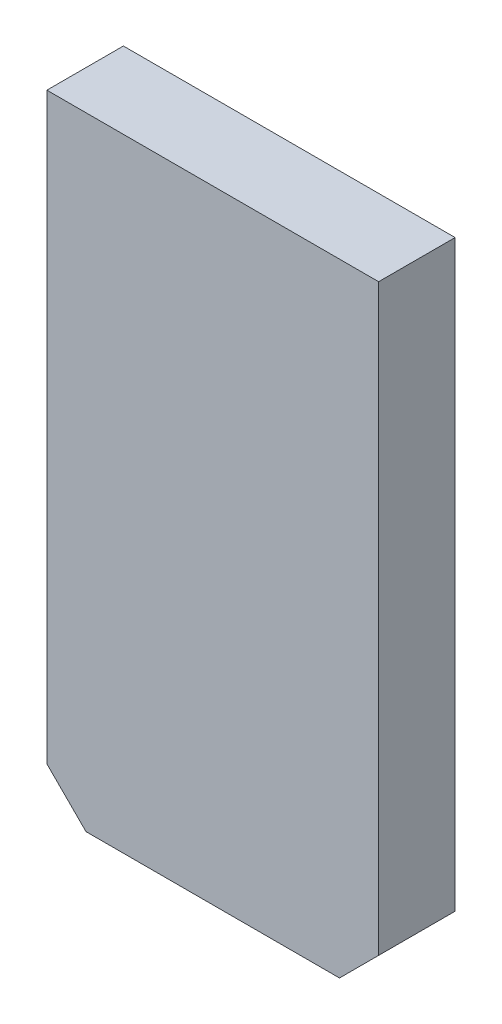
ISO-10303-21;
HEADER;
FILE_DESCRIPTION(('STEP AP214'),'2;1');
FILE_NAME('part.step','',(''),(''),'','','');
FILE_SCHEMA(('AUTOMOTIVE_DESIGN { 1 0 10303 214 1 1 1 1 }'));
ENDSEC;
DATA;
#1=APPLICATION_CONTEXT('core data for automotive mechanical design processes');
#2=APPLICATION_PROTOCOL_DEFINITION('international standard','automotive_design',2000,#1);
#3=PRODUCT_CONTEXT('',#1,'mechanical');
#4=PRODUCT('Part','Part','',(#3));
#5=PRODUCT_RELATED_PRODUCT_CATEGORY('part','',(#4));
#6=PRODUCT_DEFINITION_FORMATION('','',#4);
#7=PRODUCT_DEFINITION_CONTEXT('part definition',#1,'design');
#8=PRODUCT_DEFINITION('design','',#6,#7);
#9=PRODUCT_DEFINITION_SHAPE('','',#8);
#10=(LENGTH_UNIT() NAMED_UNIT(*) SI_UNIT(.MILLI.,.METRE.));
#11=(NAMED_UNIT(*) PLANE_ANGLE_UNIT() SI_UNIT($,.RADIAN.));
#12=(NAMED_UNIT(*) SI_UNIT($,.STERADIAN.) SOLID_ANGLE_UNIT());
#13=UNCERTAINTY_MEASURE_WITH_UNIT(LENGTH_MEASURE(1.E-05),#10,'distance_accuracy_value','');
#14=(GEOMETRIC_REPRESENTATION_CONTEXT(3) GLOBAL_UNCERTAINTY_ASSIGNED_CONTEXT((#13)) GLOBAL_UNIT_ASSIGNED_CONTEXT((#10,
#11,#12)) REPRESENTATION_CONTEXT('',''));
#15=CARTESIAN_POINT('',(0.,0.,0.));
#16=DIRECTION('',(0.,0.,1.));
#17=DIRECTION('',(1.,0.,0.));
#18=AXIS2_PLACEMENT_3D('',#15,#16,#17);
#19=CARTESIAN_POINT('',(9.17860311067414,0.548213984481267,-0.86));
#20=DIRECTION('',(-0.707106781186548,0.707106781186546,0.));
#21=DIRECTION('',(-0.707106781186546,-0.707106781186549,0.));
#22=AXIS2_PLACEMENT_3D('',#19,#20,#21);
#23=PLANE('',#22);
#24=DIRECTION('',(-0.707106781186546,-0.707106781186549,0.));
#25=VECTOR('',#24,1.);
#26=CARTESIAN_POINT('',(9.17860311067414,0.548213984481267,0.));
#27=LINE('',#26,#25);
#28=CARTESIAN_POINT('',(9.17860311067414,0.548213984481267,0.));
#29=VERTEX_POINT('',#28);
#30=CARTESIAN_POINT('',(8.73860311067414,0.108213984481266,0.));
#31=VERTEX_POINT('',#30);
#32=EDGE_CURVE('E119',#29,#31,#27,.T.);
#33=ORIENTED_EDGE('',*,*,#32,.T.);
#34=DIRECTION('',(0.,0.,1.));
#35=VECTOR('',#34,1.);
#36=CARTESIAN_POINT('',(8.73860311067414,0.108213984481266,-0.86));
#37=LINE('',#36,#35);
#38=CARTESIAN_POINT('',(8.73860311067414,0.108213984481266,-0.86));
#39=VERTEX_POINT('',#38);
#40=EDGE_CURVE('E11',#39,#31,#37,.T.);
#41=ORIENTED_EDGE('',*,*,#40,.F.);
#42=DIRECTION('',(-0.707106781186546,-0.707106781186549,0.));
#43=VECTOR('',#42,1.);
#44=CARTESIAN_POINT('',(9.17860311067414,0.548213984481267,-0.86));
#45=LINE('',#44,#43);
#46=CARTESIAN_POINT('',(9.17860311067414,0.548213984481267,-0.86));
#47=VERTEX_POINT('',#46);
#48=EDGE_CURVE('E129',#47,#39,#45,.T.);
#49=ORIENTED_EDGE('',*,*,#48,.F.);
#50=DIRECTION('',(0.,0.,1.));
#51=VECTOR('',#50,1.);
#52=CARTESIAN_POINT('',(9.17860311067414,0.548213984481267,-0.86));
#53=LINE('',#52,#51);
#54=EDGE_CURVE('E115',#47,#29,#53,.T.);
#55=ORIENTED_EDGE('',*,*,#54,.T.);
#56=EDGE_LOOP('',(#33,#41,#49,#55));
#57=FACE_BOUND('',#56,.T.);
#58=ADVANCED_FACE('F35',(#57),#23,.F.);
#59=CARTESIAN_POINT('',(8.73860311067414,0.108213984481266,-0.86));
#60=DIRECTION('',(0.,1.,0.));
#61=DIRECTION('',(0.,0.,1.));
#62=AXIS2_PLACEMENT_3D('',#59,#60,#61);
#63=PLANE('',#62);
#64=DIRECTION('',(-1.,0.,0.));
#65=VECTOR('',#64,1.);
#66=CARTESIAN_POINT('',(8.73860311067414,0.108213984481266,0.));
#67=LINE('',#66,#65);
#68=CARTESIAN_POINT('',(5.88860311067414,0.108213984481266,0.));
#69=VERTEX_POINT('',#68);
#70=EDGE_CURVE('E122',#31,#69,#67,.T.);
#71=ORIENTED_EDGE('',*,*,#70,.T.);
#72=DIRECTION('',(0.,0.,1.));
#73=VECTOR('',#72,1.);
#74=CARTESIAN_POINT('',(5.88860311067414,0.108213984481266,-0.86));
#75=LINE('',#74,#73);
#76=CARTESIAN_POINT('',(5.88860311067414,0.108213984481266,-0.86));
#77=VERTEX_POINT('',#76);
#78=EDGE_CURVE('E43',#77,#69,#75,.T.);
#79=ORIENTED_EDGE('',*,*,#78,.F.);
#80=DIRECTION('',(-1.,0.,0.));
#81=VECTOR('',#80,1.);
#82=CARTESIAN_POINT('',(8.73860311067414,0.108213984481266,-0.86));
#83=LINE('',#82,#81);
#84=EDGE_CURVE('E88',#39,#77,#83,.T.);
#85=ORIENTED_EDGE('',*,*,#84,.F.);
#86=ORIENTED_EDGE('',*,*,#40,.T.);
#87=EDGE_LOOP('',(#71,#79,#85,#86));
#88=FACE_BOUND('',#87,.T.);
#89=ADVANCED_FACE('F153',(#88),#63,.F.);
#90=CARTESIAN_POINT('',(5.88860311067414,0.108213984481266,-0.86));
#91=DIRECTION('',(0.707106781186547,0.707106781186547,0.));
#92=DIRECTION('',(-0.707106781186548,0.707106781186548,0.));
#93=AXIS2_PLACEMENT_3D('',#90,#91,#92);
#94=PLANE('',#93);
#95=DIRECTION('',(-0.707106781186548,0.707106781186548,0.));
#96=VECTOR('',#95,1.);
#97=CARTESIAN_POINT('',(5.88860311067414,0.108213984481266,0.));
#98=LINE('',#97,#96);
#99=CARTESIAN_POINT('',(5.44860311067414,0.548213984481266,0.));
#100=VERTEX_POINT('',#99);
#101=EDGE_CURVE('E124',#69,#100,#98,.T.);
#102=ORIENTED_EDGE('',*,*,#101,.T.);
#103=DIRECTION('',(0.,0.,1.));
#104=VECTOR('',#103,1.);
#105=CARTESIAN_POINT('',(5.44860311067414,0.548213984481266,-0.86));
#106=LINE('',#105,#104);
#107=CARTESIAN_POINT('',(5.44860311067414,0.548213984481266,-0.86));
#108=VERTEX_POINT('',#107);
#109=EDGE_CURVE('E110',#108,#100,#106,.T.);
#110=ORIENTED_EDGE('',*,*,#109,.F.);
#111=DIRECTION('',(-0.707106781186548,0.707106781186548,0.));
#112=VECTOR('',#111,1.);
#113=CARTESIAN_POINT('',(5.88860311067414,0.108213984481266,-0.86));
#114=LINE('',#113,#112);
#115=EDGE_CURVE('E101',#77,#108,#114,.T.);
#116=ORIENTED_EDGE('',*,*,#115,.F.);
#117=ORIENTED_EDGE('',*,*,#78,.T.);
#118=EDGE_LOOP('',(#102,#110,#116,#117));
#119=FACE_BOUND('',#118,.T.);
#120=ADVANCED_FACE('F135',(#119),#94,.F.);
#121=CARTESIAN_POINT('',(5.44860311067414,0.548213984481266,-0.86));
#122=DIRECTION('',(1.,0.,0.));
#123=DIRECTION('',(0.,1.,0.));
#124=AXIS2_PLACEMENT_3D('',#121,#122,#123);
#125=PLANE('',#124);
#126=DIRECTION('',(0.,1.,0.));
#127=VECTOR('',#126,1.);
#128=CARTESIAN_POINT('',(5.44860311067414,0.548213984481266,0.));
#129=LINE('',#128,#127);
#130=CARTESIAN_POINT('',(5.44860311067414,7.10821398448127,0.));
#131=VERTEX_POINT('',#130);
#132=EDGE_CURVE('E109',#100,#131,#129,.T.);
#133=ORIENTED_EDGE('',*,*,#132,.T.);
#134=DIRECTION('',(0.,0.,1.));
#135=VECTOR('',#134,1.);
#136=CARTESIAN_POINT('',(5.44860311067414,7.10821398448127,-0.86));
#137=LINE('',#136,#135);
#138=CARTESIAN_POINT('',(5.44860311067414,7.10821398448127,-0.86));
#139=VERTEX_POINT('',#138);
#140=EDGE_CURVE('E106',#139,#131,#137,.T.);
#141=ORIENTED_EDGE('',*,*,#140,.F.);
#142=DIRECTION('',(0.,1.,0.));
#143=VECTOR('',#142,1.);
#144=CARTESIAN_POINT('',(5.44860311067414,0.548213984481266,-0.86));
#145=LINE('',#144,#143);
#146=EDGE_CURVE('E95',#108,#139,#145,.T.);
#147=ORIENTED_EDGE('',*,*,#146,.F.);
#148=ORIENTED_EDGE('',*,*,#109,.T.);
#149=EDGE_LOOP('',(#133,#141,#147,#148));
#150=FACE_BOUND('',#149,.T.);
#151=ADVANCED_FACE('F107',(#150),#125,.F.);
#152=CARTESIAN_POINT('',(5.44860311067414,7.10821398448127,-0.86));
#153=DIRECTION('',(0.,-1.,0.));
#154=DIRECTION('',(1.,0.,0.));
#155=AXIS2_PLACEMENT_3D('',#152,#153,#154);
#156=PLANE('',#155);
#157=DIRECTION('',(1.,0.,0.));
#158=VECTOR('',#157,1.);
#159=CARTESIAN_POINT('',(5.44860311067414,7.10821398448127,0.));
#160=LINE('',#159,#158);
#161=CARTESIAN_POINT('',(9.17860311067414,7.10821398448127,0.));
#162=VERTEX_POINT('',#161);
#163=EDGE_CURVE('E74',#131,#162,#160,.T.);
#164=ORIENTED_EDGE('',*,*,#163,.T.);
#165=DIRECTION('',(0.,0.,1.));
#166=VECTOR('',#165,1.);
#167=CARTESIAN_POINT('',(9.17860311067414,7.10821398448127,-0.86));
#168=LINE('',#167,#166);
#169=CARTESIAN_POINT('',(9.17860311067414,7.10821398448127,-0.86));
#170=VERTEX_POINT('',#169);
#171=EDGE_CURVE('E111',#170,#162,#168,.T.);
#172=ORIENTED_EDGE('',*,*,#171,.F.);
#173=DIRECTION('',(1.,0.,0.));
#174=VECTOR('',#173,1.);
#175=CARTESIAN_POINT('',(5.44860311067414,7.10821398448127,-0.86));
#176=LINE('',#175,#174);
#177=EDGE_CURVE('E99',#139,#170,#176,.T.);
#178=ORIENTED_EDGE('',*,*,#177,.F.);
#179=ORIENTED_EDGE('',*,*,#140,.T.);
#180=EDGE_LOOP('',(#164,#172,#178,#179));
#181=FACE_BOUND('',#180,.T.);
#182=ADVANCED_FACE('F113',(#181),#156,.F.);
#183=CARTESIAN_POINT('',(9.17860311067414,7.10821398448127,-0.86));
#184=DIRECTION('',(-1.,0.,0.));
#185=DIRECTION('',(0.,0.,1.));
#186=AXIS2_PLACEMENT_3D('',#183,#184,#185);
#187=PLANE('',#186);
#188=DIRECTION('',(0.,-1.,0.));
#189=VECTOR('',#188,1.);
#190=CARTESIAN_POINT('',(9.17860311067414,7.10821398448127,0.));
#191=LINE('',#190,#189);
#192=EDGE_CURVE('E80',#162,#29,#191,.T.);
#193=ORIENTED_EDGE('',*,*,#192,.T.);
#194=ORIENTED_EDGE('',*,*,#54,.F.);
#195=DIRECTION('',(0.,-1.,0.));
#196=VECTOR('',#195,1.);
#197=CARTESIAN_POINT('',(9.17860311067414,7.10821398448127,-0.86));
#198=LINE('',#197,#196);
#199=EDGE_CURVE('E51',#170,#47,#198,.T.);
#200=ORIENTED_EDGE('',*,*,#199,.F.);
#201=ORIENTED_EDGE('',*,*,#171,.T.);
#202=EDGE_LOOP('',(#193,#194,#200,#201));
#203=FACE_BOUND('',#202,.T.);
#204=ADVANCED_FACE('F142',(#203),#187,.F.);
#205=CARTESIAN_POINT('',(0.,0.,-0.86));
#206=DIRECTION('',(0.,0.,-1.));
#207=DIRECTION('',(-1.,0.,0.));
#208=AXIS2_PLACEMENT_3D('',#205,#206,#207);
#209=PLANE('',#208);
#210=ORIENTED_EDGE('',*,*,#48,.T.);
#211=ORIENTED_EDGE('',*,*,#84,.T.);
#212=ORIENTED_EDGE('',*,*,#115,.T.);
#213=ORIENTED_EDGE('',*,*,#146,.T.);
#214=ORIENTED_EDGE('',*,*,#177,.T.);
#215=ORIENTED_EDGE('',*,*,#199,.T.);
#216=EDGE_LOOP('',(#210,#211,#212,#213,#214,#215));
#217=FACE_BOUND('',#216,.T.);
#218=ADVANCED_FACE('F97',(#217),#209,.T.);
#219=CARTESIAN_POINT('',(0.,0.,0.));
#220=DIRECTION('',(0.,0.,-1.));
#221=DIRECTION('',(-1.,0.,0.));
#222=AXIS2_PLACEMENT_3D('',#219,#220,#221);
#223=PLANE('',#222);
#224=ORIENTED_EDGE('',*,*,#32,.F.);
#225=ORIENTED_EDGE('',*,*,#192,.F.);
#226=ORIENTED_EDGE('',*,*,#163,.F.);
#227=ORIENTED_EDGE('',*,*,#132,.F.);
#228=ORIENTED_EDGE('',*,*,#101,.F.);
#229=ORIENTED_EDGE('',*,*,#70,.F.);
#230=EDGE_LOOP('',(#224,#225,#226,#227,#228,#229));
#231=FACE_BOUND('',#230,.T.);
#232=ADVANCED_FACE('F138',(#231),#223,.F.);
#233=CLOSED_SHELL('',(#58,#89,#120,#151,#182,#204,#218,#232));
#234=MANIFOLD_SOLID_BREP('B2',#233);
#235=ADVANCED_BREP_SHAPE_REPRESENTATION('',(#18,#234),#14);
#236=SHAPE_DEFINITION_REPRESENTATION(#9,#235);
ENDSEC;
END-ISO-10303-21;
